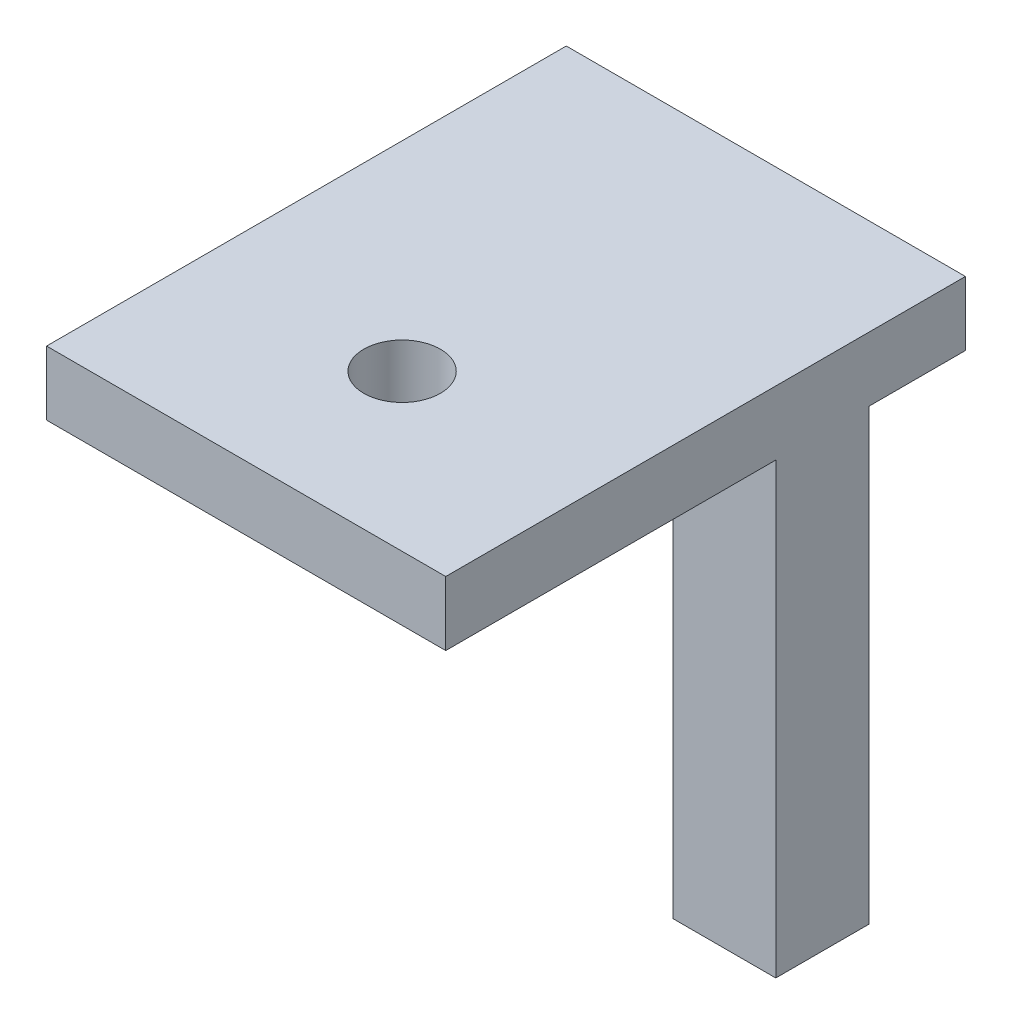
ISO-10303-21;
HEADER;
FILE_DESCRIPTION(('STEP AP214'),'2;1');
FILE_NAME('part.step','',(''),(''),'','','');
FILE_SCHEMA(('AUTOMOTIVE_DESIGN { 1 0 10303 214 1 1 1 1 }'));
ENDSEC;
DATA;
#1=APPLICATION_CONTEXT('core data for automotive mechanical design processes');
#2=APPLICATION_PROTOCOL_DEFINITION('international standard','automotive_design',2000,#1);
#3=PRODUCT_CONTEXT('',#1,'mechanical');
#4=PRODUCT('Part','Part','',(#3));
#5=PRODUCT_RELATED_PRODUCT_CATEGORY('part','',(#4));
#6=PRODUCT_DEFINITION_FORMATION('','',#4);
#7=PRODUCT_DEFINITION_CONTEXT('part definition',#1,'design');
#8=PRODUCT_DEFINITION('design','',#6,#7);
#9=PRODUCT_DEFINITION_SHAPE('','',#8);
#10=(LENGTH_UNIT() NAMED_UNIT(*) SI_UNIT(.MILLI.,.METRE.));
#11=(NAMED_UNIT(*) PLANE_ANGLE_UNIT() SI_UNIT($,.RADIAN.));
#12=(NAMED_UNIT(*) SI_UNIT($,.STERADIAN.) SOLID_ANGLE_UNIT());
#13=UNCERTAINTY_MEASURE_WITH_UNIT(LENGTH_MEASURE(1.E-05),#10,'distance_accuracy_value','');
#14=(GEOMETRIC_REPRESENTATION_CONTEXT(3) GLOBAL_UNCERTAINTY_ASSIGNED_CONTEXT((#13)) GLOBAL_UNIT_ASSIGNED_CONTEXT((#10,
#11,#12)) REPRESENTATION_CONTEXT('',''));
#15=CARTESIAN_POINT('',(0.,0.,0.));
#16=DIRECTION('',(0.,0.,1.));
#17=DIRECTION('',(1.,0.,0.));
#18=AXIS2_PLACEMENT_3D('',#15,#16,#17);
#19=CARTESIAN_POINT('',(0.,0.,0.));
#20=DIRECTION('',(0.,1.,0.));
#21=DIRECTION('',(0.,0.,1.));
#22=AXIS2_PLACEMENT_3D('',#19,#20,#21);
#23=PLANE('',#22);
#24=CARTESIAN_POINT('',(0.,0.,16.192065));
#25=DIRECTION('',(0.,1.,0.));
#26=DIRECTION('',(0.,0.,1.));
#27=AXIS2_PLACEMENT_3D('',#24,#25,#26);
#28=CIRCLE('',#27,5.969);
#29=CARTESIAN_POINT('',(0.,0.,22.161065));
#30=VERTEX_POINT('',#29);
#31=EDGE_CURVE('E142',#30,#30,#28,.T.);
#32=ORIENTED_EDGE('',*,*,#31,.T.);
#33=EDGE_LOOP('',(#32));
#34=FACE_BOUND('',#33,.T.);
#35=DIRECTION('',(1.,0.,0.));
#36=VECTOR('',#35,1.);
#37=CARTESIAN_POINT('',(31.1,0.,-25.492065));
#38=LINE('',#37,#36);
#39=CARTESIAN_POINT('',(15.1,0.,-25.492065));
#40=VERTEX_POINT('',#39);
#41=CARTESIAN_POINT('',(31.1,0.,-25.492065));
#42=VERTEX_POINT('',#41);
#43=EDGE_CURVE('E61',#40,#42,#38,.T.);
#44=ORIENTED_EDGE('',*,*,#43,.F.);
#45=DIRECTION('',(0.,0.,-1.));
#46=VECTOR('',#45,1.);
#47=CARTESIAN_POINT('',(15.1,0.,-25.492065));
#48=LINE('',#47,#46);
#49=CARTESIAN_POINT('',(15.1,0.,-10.939425));
#50=VERTEX_POINT('',#49);
#51=EDGE_CURVE('E304',#50,#40,#48,.T.);
#52=ORIENTED_EDGE('',*,*,#51,.F.);
#53=DIRECTION('',(-1.,0.,0.));
#54=VECTOR('',#53,1.);
#55=CARTESIAN_POINT('',(31.1,0.,-10.939425));
#56=LINE('',#55,#54);
#57=CARTESIAN_POINT('',(31.1,0.,-10.939425));
#58=VERTEX_POINT('',#57);
#59=EDGE_CURVE('E314',#58,#50,#56,.T.);
#60=ORIENTED_EDGE('',*,*,#59,.F.);
#61=DIRECTION('',(0.,0.,-1.));
#62=VECTOR('',#61,1.);
#63=CARTESIAN_POINT('',(31.1,0.,-40.492065));
#64=LINE('',#63,#62);
#65=CARTESIAN_POINT('',(31.1,0.,40.492065));
#66=VERTEX_POINT('',#65);
#67=EDGE_CURVE('E135',#66,#58,#64,.T.);
#68=ORIENTED_EDGE('',*,*,#67,.F.);
#69=DIRECTION('',(1.,0.,0.));
#70=VECTOR('',#69,1.);
#71=CARTESIAN_POINT('',(-31.1,0.,40.492065));
#72=LINE('',#71,#70);
#73=CARTESIAN_POINT('',(-31.1,0.,40.492065));
#74=VERTEX_POINT('',#73);
#75=EDGE_CURVE('E156',#74,#66,#72,.T.);
#76=ORIENTED_EDGE('',*,*,#75,.F.);
#77=DIRECTION('',(0.,0.,1.));
#78=VECTOR('',#77,1.);
#79=CARTESIAN_POINT('',(-31.1,0.,-40.492065));
#80=LINE('',#79,#78);
#81=CARTESIAN_POINT('',(-31.1,0.,-40.492065));
#82=VERTEX_POINT('',#81);
#83=EDGE_CURVE('E171',#82,#74,#80,.T.);
#84=ORIENTED_EDGE('',*,*,#83,.F.);
#85=DIRECTION('',(-1.,0.,0.));
#86=VECTOR('',#85,1.);
#87=CARTESIAN_POINT('',(-31.1,0.,-40.492065));
#88=LINE('',#87,#86);
#89=CARTESIAN_POINT('',(31.1,0.,-40.492065));
#90=VERTEX_POINT('',#89);
#91=EDGE_CURVE('E168',#90,#82,#88,.T.);
#92=ORIENTED_EDGE('',*,*,#91,.F.);
#93=EDGE_CURVE('E66',#42,#90,#64,.T.);
#94=ORIENTED_EDGE('',*,*,#93,.F.);
#95=EDGE_LOOP('',(#44,#52,#60,#68,#76,#84,#92,#94));
#96=FACE_BOUND('',#95,.T.);
#97=ADVANCED_FACE('F45',(#34,#96),#23,.F.);
#98=CARTESIAN_POINT('',(31.1,10.,-40.492065));
#99=DIRECTION('',(-1.,0.,0.));
#100=DIRECTION('',(0.,0.,1.));
#101=AXIS2_PLACEMENT_3D('',#98,#99,#100);
#102=PLANE('',#101);
#103=ORIENTED_EDGE('',*,*,#67,.T.);
#104=DIRECTION('',(0.,1.,0.));
#105=VECTOR('',#104,1.);
#106=CARTESIAN_POINT('',(31.1,-69.9,-10.939425));
#107=LINE('',#106,#105);
#108=CARTESIAN_POINT('',(31.1,-69.9,-10.939425));
#109=VERTEX_POINT('',#108);
#110=EDGE_CURVE('E114',#109,#58,#107,.T.);
#111=ORIENTED_EDGE('',*,*,#110,.F.);
#112=DIRECTION('',(0.,0.,1.));
#113=VECTOR('',#112,1.);
#114=CARTESIAN_POINT('',(31.1,-69.9,-25.492065));
#115=LINE('',#114,#113);
#116=CARTESIAN_POINT('',(31.1,-69.9,-25.492065));
#117=VERTEX_POINT('',#116);
#118=EDGE_CURVE('E121',#117,#109,#115,.T.);
#119=ORIENTED_EDGE('',*,*,#118,.F.);
#120=DIRECTION('',(0.,1.,0.));
#121=VECTOR('',#120,1.);
#122=CARTESIAN_POINT('',(31.1,-69.9,-25.492065));
#123=LINE('',#122,#121);
#124=EDGE_CURVE('E301',#117,#42,#123,.T.);
#125=ORIENTED_EDGE('',*,*,#124,.T.);
#126=ORIENTED_EDGE('',*,*,#93,.T.);
#127=DIRECTION('',(0.,-1.,0.));
#128=VECTOR('',#127,1.);
#129=CARTESIAN_POINT('',(31.1,10.,-40.492065));
#130=LINE('',#129,#128);
#131=CARTESIAN_POINT('',(31.1,10.,-40.492065));
#132=VERTEX_POINT('',#131);
#133=EDGE_CURVE('E11',#132,#90,#130,.T.);
#134=ORIENTED_EDGE('',*,*,#133,.F.);
#135=DIRECTION('',(0.,0.,-1.));
#136=VECTOR('',#135,1.);
#137=CARTESIAN_POINT('',(31.1,10.,-40.492065));
#138=LINE('',#137,#136);
#139=CARTESIAN_POINT('',(31.1,10.,40.492065));
#140=VERTEX_POINT('',#139);
#141=EDGE_CURVE('E151',#140,#132,#138,.T.);
#142=ORIENTED_EDGE('',*,*,#141,.F.);
#143=DIRECTION('',(0.,-1.,0.));
#144=VECTOR('',#143,1.);
#145=CARTESIAN_POINT('',(31.1,10.,40.492065));
#146=LINE('',#145,#144);
#147=EDGE_CURVE('E165',#140,#66,#146,.T.);
#148=ORIENTED_EDGE('',*,*,#147,.T.);
#149=EDGE_LOOP('',(#103,#111,#119,#125,#126,#134,#142,#148));
#150=FACE_BOUND('',#149,.T.);
#151=ADVANCED_FACE('F47',(#150),#102,.F.);
#152=CARTESIAN_POINT('',(-31.1,10.,-40.492065));
#153=DIRECTION('',(0.,0.,1.));
#154=DIRECTION('',(1.,0.,0.));
#155=AXIS2_PLACEMENT_3D('',#152,#153,#154);
#156=PLANE('',#155);
#157=ORIENTED_EDGE('',*,*,#91,.T.);
#158=DIRECTION('',(0.,-1.,0.));
#159=VECTOR('',#158,1.);
#160=CARTESIAN_POINT('',(-31.1,10.,-40.492065));
#161=LINE('',#160,#159);
#162=CARTESIAN_POINT('',(-31.1,10.,-40.492065));
#163=VERTEX_POINT('',#162);
#164=EDGE_CURVE('E54',#163,#82,#161,.T.);
#165=ORIENTED_EDGE('',*,*,#164,.F.);
#166=DIRECTION('',(-1.,0.,0.));
#167=VECTOR('',#166,1.);
#168=CARTESIAN_POINT('',(-31.1,10.,-40.492065));
#169=LINE('',#168,#167);
#170=EDGE_CURVE('E155',#132,#163,#169,.T.);
#171=ORIENTED_EDGE('',*,*,#170,.F.);
#172=ORIENTED_EDGE('',*,*,#133,.T.);
#173=EDGE_LOOP('',(#157,#165,#171,#172));
#174=FACE_BOUND('',#173,.T.);
#175=ADVANCED_FACE('F199',(#174),#156,.F.);
#176=CARTESIAN_POINT('',(-31.1,10.,-40.492065));
#177=DIRECTION('',(1.,0.,0.));
#178=DIRECTION('',(0.,0.,-1.));
#179=AXIS2_PLACEMENT_3D('',#176,#177,#178);
#180=PLANE('',#179);
#181=ORIENTED_EDGE('',*,*,#83,.T.);
#182=DIRECTION('',(0.,-1.,0.));
#183=VECTOR('',#182,1.);
#184=CARTESIAN_POINT('',(-31.1,10.,40.492065));
#185=LINE('',#184,#183);
#186=CARTESIAN_POINT('',(-31.1,10.,40.492065));
#187=VERTEX_POINT('',#186);
#188=EDGE_CURVE('E178',#187,#74,#185,.T.);
#189=ORIENTED_EDGE('',*,*,#188,.F.);
#190=DIRECTION('',(0.,0.,1.));
#191=VECTOR('',#190,1.);
#192=CARTESIAN_POINT('',(-31.1,10.,-40.492065));
#193=LINE('',#192,#191);
#194=EDGE_CURVE('E159',#163,#187,#193,.T.);
#195=ORIENTED_EDGE('',*,*,#194,.F.);
#196=ORIENTED_EDGE('',*,*,#164,.T.);
#197=EDGE_LOOP('',(#181,#189,#195,#196));
#198=FACE_BOUND('',#197,.T.);
#199=ADVANCED_FACE('F187',(#198),#180,.F.);
#200=CARTESIAN_POINT('',(-31.1,10.,40.492065));
#201=DIRECTION('',(0.,0.,-1.));
#202=DIRECTION('',(-1.,0.,0.));
#203=AXIS2_PLACEMENT_3D('',#200,#201,#202);
#204=PLANE('',#203);
#205=ORIENTED_EDGE('',*,*,#75,.T.);
#206=ORIENTED_EDGE('',*,*,#147,.F.);
#207=DIRECTION('',(1.,0.,0.));
#208=VECTOR('',#207,1.);
#209=CARTESIAN_POINT('',(-31.1,10.,40.492065));
#210=LINE('',#209,#208);
#211=EDGE_CURVE('E162',#187,#140,#210,.T.);
#212=ORIENTED_EDGE('',*,*,#211,.F.);
#213=ORIENTED_EDGE('',*,*,#188,.T.);
#214=EDGE_LOOP('',(#205,#206,#212,#213));
#215=FACE_BOUND('',#214,.T.);
#216=ADVANCED_FACE('F193',(#215),#204,.F.);
#217=CARTESIAN_POINT('',(0.,10.,0.));
#218=DIRECTION('',(0.,1.,0.));
#219=DIRECTION('',(0.,0.,1.));
#220=AXIS2_PLACEMENT_3D('',#217,#218,#219);
#221=PLANE('',#220);
#222=CARTESIAN_POINT('',(0.,10.,16.192065));
#223=DIRECTION('',(0.,1.,0.));
#224=DIRECTION('',(0.,0.,1.));
#225=AXIS2_PLACEMENT_3D('',#222,#223,#224);
#226=CIRCLE('',#225,5.969);
#227=CARTESIAN_POINT('',(0.,10.,22.161065));
#228=VERTEX_POINT('',#227);
#229=EDGE_CURVE('E137',#228,#228,#226,.T.);
#230=ORIENTED_EDGE('',*,*,#229,.F.);
#231=EDGE_LOOP('',(#230));
#232=FACE_BOUND('',#231,.T.);
#233=ORIENTED_EDGE('',*,*,#141,.T.);
#234=ORIENTED_EDGE('',*,*,#170,.T.);
#235=ORIENTED_EDGE('',*,*,#194,.T.);
#236=ORIENTED_EDGE('',*,*,#211,.T.);
#237=EDGE_LOOP('',(#233,#234,#235,#236));
#238=FACE_BOUND('',#237,.T.);
#239=ADVANCED_FACE('F198',(#232,#238),#221,.T.);
#240=CARTESIAN_POINT('',(0.,0.,16.192065));
#241=DIRECTION('',(0.,1.,0.));
#242=DIRECTION('',(0.,0.,1.));
#243=AXIS2_PLACEMENT_3D('',#240,#241,#242);
#244=CYLINDRICAL_SURFACE('',#243,5.969);
#245=ORIENTED_EDGE('',*,*,#31,.F.);
#246=EDGE_LOOP('',(#245));
#247=FACE_BOUND('',#246,.T.);
#248=ORIENTED_EDGE('',*,*,#229,.T.);
#249=EDGE_LOOP('',(#248));
#250=FACE_BOUND('',#249,.T.);
#251=ADVANCED_FACE('F219',(#247,#250),#244,.F.);
#252=CARTESIAN_POINT('',(31.1,-69.9,-10.939425));
#253=DIRECTION('',(0.,0.,-1.));
#254=DIRECTION('',(-1.,0.,0.));
#255=AXIS2_PLACEMENT_3D('',#252,#253,#254);
#256=PLANE('',#255);
#257=ORIENTED_EDGE('',*,*,#59,.T.);
#258=DIRECTION('',(0.,1.,0.));
#259=VECTOR('',#258,1.);
#260=CARTESIAN_POINT('',(15.1,-69.9,-10.939425));
#261=LINE('',#260,#259);
#262=CARTESIAN_POINT('',(15.1,-69.9,-10.939425));
#263=VERTEX_POINT('',#262);
#264=EDGE_CURVE('E116',#263,#50,#261,.T.);
#265=ORIENTED_EDGE('',*,*,#264,.F.);
#266=DIRECTION('',(-1.,0.,0.));
#267=VECTOR('',#266,1.);
#268=CARTESIAN_POINT('',(31.1,-69.9,-10.939425));
#269=LINE('',#268,#267);
#270=EDGE_CURVE('E109',#109,#263,#269,.T.);
#271=ORIENTED_EDGE('',*,*,#270,.F.);
#272=ORIENTED_EDGE('',*,*,#110,.T.);
#273=EDGE_LOOP('',(#257,#265,#271,#272));
#274=FACE_BOUND('',#273,.T.);
#275=ADVANCED_FACE('F112',(#274),#256,.F.);
#276=CARTESIAN_POINT('',(15.1,-69.9,-25.492065));
#277=DIRECTION('',(1.,0.,0.));
#278=DIRECTION('',(0.,0.,-1.));
#279=AXIS2_PLACEMENT_3D('',#276,#277,#278);
#280=PLANE('',#279);
#281=ORIENTED_EDGE('',*,*,#51,.T.);
#282=DIRECTION('',(0.,1.,0.));
#283=VECTOR('',#282,1.);
#284=CARTESIAN_POINT('',(15.1,-69.9,-25.492065));
#285=LINE('',#284,#283);
#286=CARTESIAN_POINT('',(15.1,-69.9,-25.492065));
#287=VERTEX_POINT('',#286);
#288=EDGE_CURVE('E144',#287,#40,#285,.T.);
#289=ORIENTED_EDGE('',*,*,#288,.F.);
#290=DIRECTION('',(0.,0.,-1.));
#291=VECTOR('',#290,1.);
#292=CARTESIAN_POINT('',(15.1,-69.9,-25.492065));
#293=LINE('',#292,#291);
#294=EDGE_CURVE('E120',#263,#287,#293,.T.);
#295=ORIENTED_EDGE('',*,*,#294,.F.);
#296=ORIENTED_EDGE('',*,*,#264,.T.);
#297=EDGE_LOOP('',(#281,#289,#295,#296));
#298=FACE_BOUND('',#297,.T.);
#299=ADVANCED_FACE('F229',(#298),#280,.F.);
#300=CARTESIAN_POINT('',(31.1,-69.9,-25.492065));
#301=DIRECTION('',(0.,0.,1.));
#302=DIRECTION('',(1.,0.,0.));
#303=AXIS2_PLACEMENT_3D('',#300,#301,#302);
#304=PLANE('',#303);
#305=ORIENTED_EDGE('',*,*,#43,.T.);
#306=ORIENTED_EDGE('',*,*,#124,.F.);
#307=DIRECTION('',(1.,0.,0.));
#308=VECTOR('',#307,1.);
#309=CARTESIAN_POINT('',(31.1,-69.9,-25.492065));
#310=LINE('',#309,#308);
#311=EDGE_CURVE('E126',#287,#117,#310,.T.);
#312=ORIENTED_EDGE('',*,*,#311,.F.);
#313=ORIENTED_EDGE('',*,*,#288,.T.);
#314=EDGE_LOOP('',(#305,#306,#312,#313));
#315=FACE_BOUND('',#314,.T.);
#316=ADVANCED_FACE('F235',(#315),#304,.F.);
#317=CARTESIAN_POINT('',(0.,-69.9,0.));
#318=DIRECTION('',(0.,-1.,0.));
#319=DIRECTION('',(0.,0.,-1.));
#320=AXIS2_PLACEMENT_3D('',#317,#318,#319);
#321=PLANE('',#320);
#322=ORIENTED_EDGE('',*,*,#118,.T.);
#323=ORIENTED_EDGE('',*,*,#270,.T.);
#324=ORIENTED_EDGE('',*,*,#294,.T.);
#325=ORIENTED_EDGE('',*,*,#311,.T.);
#326=EDGE_LOOP('',(#322,#323,#324,#325));
#327=FACE_BOUND('',#326,.T.);
#328=ADVANCED_FACE('F124',(#327),#321,.T.);
#329=CLOSED_SHELL('',(#97,#151,#175,#199,#216,#239,#251,#275,#299,#316,#328));
#330=MANIFOLD_SOLID_BREP('B2',#329);
#331=ADVANCED_BREP_SHAPE_REPRESENTATION('',(#18,#330),#14);
#332=SHAPE_DEFINITION_REPRESENTATION(#9,#331);
ENDSEC;
END-ISO-10303-21;
